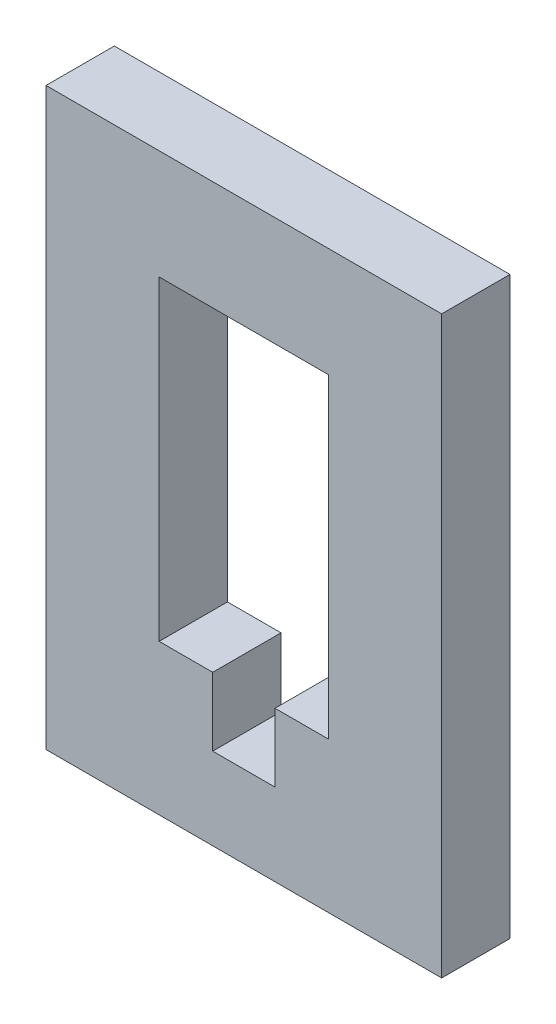
ISO-10303-21;
HEADER;
FILE_DESCRIPTION(('STEP AP214'),'2;1');
FILE_NAME('part.step','',(''),(''),'','','');
FILE_SCHEMA(('AUTOMOTIVE_DESIGN { 1 0 10303 214 1 1 1 1 }'));
ENDSEC;
DATA;
#1=APPLICATION_CONTEXT('core data for automotive mechanical design processes');
#2=APPLICATION_PROTOCOL_DEFINITION('international standard','automotive_design',2000,#1);
#3=PRODUCT_CONTEXT('',#1,'mechanical');
#4=PRODUCT('Part','Part','',(#3));
#5=PRODUCT_RELATED_PRODUCT_CATEGORY('part','',(#4));
#6=PRODUCT_DEFINITION_FORMATION('','',#4);
#7=PRODUCT_DEFINITION_CONTEXT('part definition',#1,'design');
#8=PRODUCT_DEFINITION('design','',#6,#7);
#9=PRODUCT_DEFINITION_SHAPE('','',#8);
#10=(LENGTH_UNIT() NAMED_UNIT(*) SI_UNIT(.MILLI.,.METRE.));
#11=(NAMED_UNIT(*) PLANE_ANGLE_UNIT() SI_UNIT($,.RADIAN.));
#12=(NAMED_UNIT(*) SI_UNIT($,.STERADIAN.) SOLID_ANGLE_UNIT());
#13=UNCERTAINTY_MEASURE_WITH_UNIT(LENGTH_MEASURE(1.E-05),#10,'distance_accuracy_value','');
#14=(GEOMETRIC_REPRESENTATION_CONTEXT(3) GLOBAL_UNCERTAINTY_ASSIGNED_CONTEXT((#13)) GLOBAL_UNIT_ASSIGNED_CONTEXT((#10,
#11,#12)) REPRESENTATION_CONTEXT('',''));
#15=CARTESIAN_POINT('',(0.,0.,0.));
#16=DIRECTION('',(0.,0.,1.));
#17=DIRECTION('',(1.,0.,0.));
#18=AXIS2_PLACEMENT_3D('',#15,#16,#17);
#19=CARTESIAN_POINT('',(-18.5582300884956,31.0897345132743,5.));
#20=DIRECTION('',(0.,-1.,0.));
#21=DIRECTION('',(0.,0.,-1.));
#22=AXIS2_PLACEMENT_3D('',#19,#20,#21);
#23=PLANE('',#22);
#24=DIRECTION('',(-1.,0.,0.));
#25=VECTOR('',#24,1.);
#26=CARTESIAN_POINT('',(-18.5582300884956,31.0897345132743,5.));
#27=LINE('',#26,#25);
#28=CARTESIAN_POINT('',(-6.35823008849556,31.0897345132743,5.));
#29=VERTEX_POINT('',#28);
#30=CARTESIAN_POINT('',(-10.2782300884956,31.0897345132743,5.));
#31=VERTEX_POINT('',#30);
#32=EDGE_CURVE('E241',#29,#31,#27,.T.);
#33=ORIENTED_EDGE('',*,*,#32,.F.);
#34=DIRECTION('',(0.,0.,1.));
#35=VECTOR('',#34,1.);
#36=CARTESIAN_POINT('',(-6.35823008849556,31.0897345132743,0.));
#37=LINE('',#36,#35);
#38=CARTESIAN_POINT('',(-6.35823008849556,31.0897345132743,0.));
#39=VERTEX_POINT('',#38);
#40=EDGE_CURVE('E136',#39,#29,#37,.T.);
#41=ORIENTED_EDGE('',*,*,#40,.F.);
#42=DIRECTION('',(-1.,0.,0.));
#43=VECTOR('',#42,1.);
#44=CARTESIAN_POINT('',(-18.5582300884956,31.0897345132743,0.));
#45=LINE('',#44,#43);
#46=CARTESIAN_POINT('',(-10.2782300884956,31.0897345132743,0.));
#47=VERTEX_POINT('',#46);
#48=EDGE_CURVE('E253',#39,#47,#45,.T.);
#49=ORIENTED_EDGE('',*,*,#48,.T.);
#50=DIRECTION('',(0.,0.,-1.));
#51=VECTOR('',#50,1.);
#52=CARTESIAN_POINT('',(-10.2782300884956,31.0897345132743,0.));
#53=LINE('',#52,#51);
#54=EDGE_CURVE('E213',#31,#47,#53,.T.);
#55=ORIENTED_EDGE('',*,*,#54,.F.);
#56=EDGE_LOOP('',(#33,#41,#49,#55));
#57=FACE_BOUND('',#56,.T.);
#58=ADVANCED_FACE('F39',(#57),#23,.F.);
#59=CARTESIAN_POINT('',(2.12176991150444,31.0897345132743,0.));
#60=VERTEX_POINT('',#59);
#61=CARTESIAN_POINT('',(-1.79823008849555,31.0897345132743,0.));
#62=VERTEX_POINT('',#61);
#63=EDGE_CURVE('E235',#60,#62,#45,.T.);
#64=ORIENTED_EDGE('',*,*,#63,.T.);
#65=DIRECTION('',(0.,0.,-1.));
#66=VECTOR('',#65,1.);
#67=CARTESIAN_POINT('',(-1.79823008849555,31.0897345132743,0.));
#68=LINE('',#67,#66);
#69=CARTESIAN_POINT('',(-1.79823008849555,31.0897345132743,5.));
#70=VERTEX_POINT('',#69);
#71=EDGE_CURVE('E150',#70,#62,#68,.T.);
#72=ORIENTED_EDGE('',*,*,#71,.F.);
#73=CARTESIAN_POINT('',(2.12176991150444,31.0897345132743,5.));
#74=VERTEX_POINT('',#73);
#75=EDGE_CURVE('E63',#74,#70,#27,.T.);
#76=ORIENTED_EDGE('',*,*,#75,.F.);
#77=DIRECTION('',(0.,0.,1.));
#78=VECTOR('',#77,1.);
#79=CARTESIAN_POINT('',(2.12176991150444,31.0897345132743,0.));
#80=LINE('',#79,#78);
#81=EDGE_CURVE('E192',#60,#74,#80,.T.);
#82=ORIENTED_EDGE('',*,*,#81,.F.);
#83=EDGE_LOOP('',(#64,#72,#76,#82));
#84=FACE_BOUND('',#83,.T.);
#85=ADVANCED_FACE('F281',(#84),#23,.F.);
#86=CARTESIAN_POINT('',(-18.5582300884956,31.0897345132743,5.));
#87=DIRECTION('',(1.,0.,0.));
#88=DIRECTION('',(0.,1.,0.));
#89=AXIS2_PLACEMENT_3D('',#86,#87,#88);
#90=PLANE('',#89);
#91=DIRECTION('',(0.,-1.,0.));
#92=VECTOR('',#91,1.);
#93=CARTESIAN_POINT('',(-18.5582300884956,31.0897345132743,0.));
#94=LINE('',#93,#92);
#95=CARTESIAN_POINT('',(-18.5582300884956,62.1897345132743,0.));
#96=VERTEX_POINT('',#95);
#97=CARTESIAN_POINT('',(-18.5582300884956,20.0897345132743,0.));
#98=VERTEX_POINT('',#97);
#99=EDGE_CURVE('E229',#96,#98,#94,.T.);
#100=ORIENTED_EDGE('',*,*,#99,.T.);
#101=DIRECTION('',(0.,0.,-1.));
#102=VECTOR('',#101,1.);
#103=CARTESIAN_POINT('',(-18.5582300884956,20.0897345132743,5.));
#104=LINE('',#103,#102);
#105=CARTESIAN_POINT('',(-18.5582300884956,20.0897345132743,5.));
#106=VERTEX_POINT('',#105);
#107=EDGE_CURVE('E11',#106,#98,#104,.T.);
#108=ORIENTED_EDGE('',*,*,#107,.F.);
#109=DIRECTION('',(0.,-1.,0.));
#110=VECTOR('',#109,1.);
#111=CARTESIAN_POINT('',(-18.5582300884956,31.0897345132743,5.));
#112=LINE('',#111,#110);
#113=CARTESIAN_POINT('',(-18.5582300884956,62.1897345132743,5.));
#114=VERTEX_POINT('',#113);
#115=EDGE_CURVE('E230',#114,#106,#112,.T.);
#116=ORIENTED_EDGE('',*,*,#115,.F.);
#117=DIRECTION('',(0.,0.,1.));
#118=VECTOR('',#117,1.);
#119=CARTESIAN_POINT('',(-18.5582300884956,62.1897345132743,0.));
#120=LINE('',#119,#118);
#121=EDGE_CURVE('E175',#96,#114,#120,.T.);
#122=ORIENTED_EDGE('',*,*,#121,.F.);
#123=EDGE_LOOP('',(#100,#108,#116,#122));
#124=FACE_BOUND('',#123,.T.);
#125=ADVANCED_FACE('F41',(#124),#90,.F.);
#126=CARTESIAN_POINT('',(-18.5582300884956,20.0897345132743,5.));
#127=DIRECTION('',(0.,1.,0.));
#128=DIRECTION('',(0.,0.,1.));
#129=AXIS2_PLACEMENT_3D('',#126,#127,#128);
#130=PLANE('',#129);
#131=DIRECTION('',(1.,0.,0.));
#132=VECTOR('',#131,1.);
#133=CARTESIAN_POINT('',(-18.5582300884956,20.0897345132743,0.));
#134=LINE('',#133,#132);
#135=CARTESIAN_POINT('',(10.4017699115044,20.0897345132743,0.));
#136=VERTEX_POINT('',#135);
#137=EDGE_CURVE('E247',#98,#136,#134,.T.);
#138=ORIENTED_EDGE('',*,*,#137,.T.);
#139=DIRECTION('',(0.,0.,-1.));
#140=VECTOR('',#139,1.);
#141=CARTESIAN_POINT('',(10.4017699115044,20.0897345132743,5.));
#142=LINE('',#141,#140);
#143=CARTESIAN_POINT('',(10.4017699115044,20.0897345132743,5.));
#144=VERTEX_POINT('',#143);
#145=EDGE_CURVE('E48',#144,#136,#142,.T.);
#146=ORIENTED_EDGE('',*,*,#145,.F.);
#147=DIRECTION('',(1.,0.,0.));
#148=VECTOR('',#147,1.);
#149=CARTESIAN_POINT('',(-18.5582300884956,20.0897345132743,5.));
#150=LINE('',#149,#148);
#151=EDGE_CURVE('E234',#106,#144,#150,.T.);
#152=ORIENTED_EDGE('',*,*,#151,.F.);
#153=ORIENTED_EDGE('',*,*,#107,.T.);
#154=EDGE_LOOP('',(#138,#146,#152,#153));
#155=FACE_BOUND('',#154,.T.);
#156=ADVANCED_FACE('F274',(#155),#130,.F.);
#157=CARTESIAN_POINT('',(10.4017699115044,31.0897345132743,5.));
#158=DIRECTION('',(-1.,0.,0.));
#159=DIRECTION('',(0.,-1.,0.));
#160=AXIS2_PLACEMENT_3D('',#157,#158,#159);
#161=PLANE('',#160);
#162=DIRECTION('',(0.,1.,0.));
#163=VECTOR('',#162,1.);
#164=CARTESIAN_POINT('',(10.4017699115044,31.0897345132743,0.));
#165=LINE('',#164,#163);
#166=CARTESIAN_POINT('',(10.4017699115044,62.1897345132743,0.));
#167=VERTEX_POINT('',#166);
#168=EDGE_CURVE('E250',#136,#167,#165,.T.);
#169=ORIENTED_EDGE('',*,*,#168,.T.);
#170=DIRECTION('',(0.,0.,-1.));
#171=VECTOR('',#170,1.);
#172=CARTESIAN_POINT('',(10.4017699115044,62.1897345132743,0.));
#173=LINE('',#172,#171);
#174=CARTESIAN_POINT('',(10.4017699115044,62.1897345132743,5.));
#175=VERTEX_POINT('',#174);
#176=EDGE_CURVE('E184',#175,#167,#173,.T.);
#177=ORIENTED_EDGE('',*,*,#176,.F.);
#178=DIRECTION('',(0.,1.,0.));
#179=VECTOR('',#178,1.);
#180=CARTESIAN_POINT('',(10.4017699115044,31.0897345132743,5.));
#181=LINE('',#180,#179);
#182=EDGE_CURVE('E238',#144,#175,#181,.T.);
#183=ORIENTED_EDGE('',*,*,#182,.F.);
#184=ORIENTED_EDGE('',*,*,#145,.T.);
#185=EDGE_LOOP('',(#169,#177,#183,#184));
#186=FACE_BOUND('',#185,.T.);
#187=ADVANCED_FACE('F262',(#186),#161,.F.);
#188=CARTESIAN_POINT('',(0.,0.,5.));
#189=DIRECTION('',(0.,0.,1.));
#190=DIRECTION('',(1.,0.,0.));
#191=AXIS2_PLACEMENT_3D('',#188,#189,#190);
#192=PLANE('',#191);
#193=DIRECTION('',(0.,1.,0.));
#194=VECTOR('',#193,1.);
#195=CARTESIAN_POINT('',(-6.35823008849556,26.0897345132743,5.));
#196=LINE('',#195,#194);
#197=CARTESIAN_POINT('',(-6.35823008849556,26.0897345132743,5.));
#198=VERTEX_POINT('',#197);
#199=EDGE_CURVE('E131',#198,#29,#196,.T.);
#200=ORIENTED_EDGE('',*,*,#199,.T.);
#201=ORIENTED_EDGE('',*,*,#32,.T.);
#202=DIRECTION('',(0.,-1.,0.));
#203=VECTOR('',#202,1.);
#204=CARTESIAN_POINT('',(-10.2782300884956,54.1897345132743,5.));
#205=LINE('',#204,#203);
#206=CARTESIAN_POINT('',(-10.2782300884956,54.1897345132743,5.));
#207=VERTEX_POINT('',#206);
#208=EDGE_CURVE('E225',#207,#31,#205,.T.);
#209=ORIENTED_EDGE('',*,*,#208,.F.);
#210=DIRECTION('',(1.,0.,0.));
#211=VECTOR('',#210,1.);
#212=CARTESIAN_POINT('',(-18.5582300884956,54.1897345132743,5.));
#213=LINE('',#212,#211);
#214=CARTESIAN_POINT('',(2.12176991150444,54.1897345132743,5.));
#215=VERTEX_POINT('',#214);
#216=EDGE_CURVE('E168',#207,#215,#213,.T.);
#217=ORIENTED_EDGE('',*,*,#216,.T.);
#218=DIRECTION('',(0.,-1.,0.));
#219=VECTOR('',#218,1.);
#220=CARTESIAN_POINT('',(2.12176991150444,54.1897345132743,5.));
#221=LINE('',#220,#219);
#222=EDGE_CURVE('E203',#215,#74,#221,.T.);
#223=ORIENTED_EDGE('',*,*,#222,.T.);
#224=ORIENTED_EDGE('',*,*,#75,.T.);
#225=DIRECTION('',(0.,1.,0.));
#226=VECTOR('',#225,1.);
#227=CARTESIAN_POINT('',(-1.79823008849555,26.0897345132743,5.));
#228=LINE('',#227,#226);
#229=CARTESIAN_POINT('',(-1.79823008849555,26.0897345132743,5.));
#230=VERTEX_POINT('',#229);
#231=EDGE_CURVE('E141',#230,#70,#228,.T.);
#232=ORIENTED_EDGE('',*,*,#231,.F.);
#233=DIRECTION('',(1.,0.,0.));
#234=VECTOR('',#233,1.);
#235=CARTESIAN_POINT('',(-6.35823008849556,26.0897345132743,5.));
#236=LINE('',#235,#234);
#237=EDGE_CURVE('E145',#198,#230,#236,.T.);
#238=ORIENTED_EDGE('',*,*,#237,.F.);
#239=EDGE_LOOP('',(#200,#201,#209,#217,#223,#224,#232,#238));
#240=FACE_BOUND('',#239,.T.);
#241=ORIENTED_EDGE('',*,*,#115,.T.);
#242=ORIENTED_EDGE('',*,*,#151,.T.);
#243=ORIENTED_EDGE('',*,*,#182,.T.);
#244=DIRECTION('',(1.,0.,0.));
#245=VECTOR('',#244,1.);
#246=CARTESIAN_POINT('',(-18.5582300884956,62.1897345132743,5.));
#247=LINE('',#246,#245);
#248=EDGE_CURVE('E179',#114,#175,#247,.T.);
#249=ORIENTED_EDGE('',*,*,#248,.F.);
#250=EDGE_LOOP('',(#241,#242,#243,#249));
#251=FACE_BOUND('',#250,.T.);
#252=ADVANCED_FACE('F152',(#240,#251),#192,.T.);
#253=CARTESIAN_POINT('',(0.,0.,0.));
#254=DIRECTION('',(0.,0.,1.));
#255=DIRECTION('',(1.,0.,0.));
#256=AXIS2_PLACEMENT_3D('',#253,#254,#255);
#257=PLANE('',#256);
#258=ORIENTED_EDGE('',*,*,#48,.F.);
#259=DIRECTION('',(0.,1.,0.));
#260=VECTOR('',#259,1.);
#261=CARTESIAN_POINT('',(-6.35823008849556,26.0897345132743,0.));
#262=LINE('',#261,#260);
#263=CARTESIAN_POINT('',(-6.35823008849556,26.0897345132743,0.));
#264=VERTEX_POINT('',#263);
#265=EDGE_CURVE('E165',#264,#39,#262,.T.);
#266=ORIENTED_EDGE('',*,*,#265,.F.);
#267=DIRECTION('',(-1.,0.,0.));
#268=VECTOR('',#267,1.);
#269=CARTESIAN_POINT('',(-6.35823008849556,26.0897345132743,0.));
#270=LINE('',#269,#268);
#271=CARTESIAN_POINT('',(-1.79823008849555,26.0897345132743,0.));
#272=VERTEX_POINT('',#271);
#273=EDGE_CURVE('E142',#272,#264,#270,.T.);
#274=ORIENTED_EDGE('',*,*,#273,.F.);
#275=DIRECTION('',(0.,1.,0.));
#276=VECTOR('',#275,1.);
#277=CARTESIAN_POINT('',(-1.79823008849555,26.0897345132743,0.));
#278=LINE('',#277,#276);
#279=EDGE_CURVE('E169',#272,#62,#278,.T.);
#280=ORIENTED_EDGE('',*,*,#279,.T.);
#281=ORIENTED_EDGE('',*,*,#63,.F.);
#282=DIRECTION('',(0.,-1.,0.));
#283=VECTOR('',#282,1.);
#284=CARTESIAN_POINT('',(2.12176991150444,54.1897345132743,0.));
#285=LINE('',#284,#283);
#286=CARTESIAN_POINT('',(2.12176991150444,54.1897345132743,0.));
#287=VERTEX_POINT('',#286);
#288=EDGE_CURVE('E209',#287,#60,#285,.T.);
#289=ORIENTED_EDGE('',*,*,#288,.F.);
#290=DIRECTION('',(-1.,0.,0.));
#291=VECTOR('',#290,1.);
#292=CARTESIAN_POINT('',(-18.5582300884956,54.1897345132743,0.));
#293=LINE('',#292,#291);
#294=CARTESIAN_POINT('',(-10.2782300884956,54.1897345132743,0.));
#295=VERTEX_POINT('',#294);
#296=EDGE_CURVE('E180',#287,#295,#293,.T.);
#297=ORIENTED_EDGE('',*,*,#296,.T.);
#298=DIRECTION('',(0.,-1.,0.));
#299=VECTOR('',#298,1.);
#300=CARTESIAN_POINT('',(-10.2782300884956,54.1897345132743,0.));
#301=LINE('',#300,#299);
#302=EDGE_CURVE('E218',#295,#47,#301,.T.);
#303=ORIENTED_EDGE('',*,*,#302,.T.);
#304=EDGE_LOOP('',(#258,#266,#274,#280,#281,#289,#297,#303));
#305=FACE_BOUND('',#304,.T.);
#306=ORIENTED_EDGE('',*,*,#99,.F.);
#307=DIRECTION('',(-1.,0.,0.));
#308=VECTOR('',#307,1.);
#309=CARTESIAN_POINT('',(-18.5582300884956,62.1897345132743,0.));
#310=LINE('',#309,#308);
#311=EDGE_CURVE('E188',#167,#96,#310,.T.);
#312=ORIENTED_EDGE('',*,*,#311,.F.);
#313=ORIENTED_EDGE('',*,*,#168,.F.);
#314=ORIENTED_EDGE('',*,*,#137,.F.);
#315=EDGE_LOOP('',(#306,#312,#313,#314));
#316=FACE_BOUND('',#315,.T.);
#317=ADVANCED_FACE('F267',(#305,#316),#257,.F.);
#318=CARTESIAN_POINT('',(-10.2782300884956,54.1897345132743,0.));
#319=DIRECTION('',(-1.,0.,0.));
#320=DIRECTION('',(0.,0.,1.));
#321=AXIS2_PLACEMENT_3D('',#318,#319,#320);
#322=PLANE('',#321);
#323=ORIENTED_EDGE('',*,*,#54,.T.);
#324=ORIENTED_EDGE('',*,*,#302,.F.);
#325=DIRECTION('',(0.,0.,-1.));
#326=VECTOR('',#325,1.);
#327=CARTESIAN_POINT('',(-10.2782300884956,54.1897345132743,0.));
#328=LINE('',#327,#326);
#329=EDGE_CURVE('E214',#207,#295,#328,.T.);
#330=ORIENTED_EDGE('',*,*,#329,.F.);
#331=ORIENTED_EDGE('',*,*,#208,.T.);
#332=EDGE_LOOP('',(#323,#324,#330,#331));
#333=FACE_BOUND('',#332,.T.);
#334=ADVANCED_FACE('F291',(#333),#322,.F.);
#335=CARTESIAN_POINT('',(2.12176991150444,54.1897345132743,0.));
#336=DIRECTION('',(1.,0.,0.));
#337=DIRECTION('',(0.,0.,-1.));
#338=AXIS2_PLACEMENT_3D('',#335,#336,#337);
#339=PLANE('',#338);
#340=ORIENTED_EDGE('',*,*,#81,.T.);
#341=ORIENTED_EDGE('',*,*,#222,.F.);
#342=DIRECTION('',(0.,0.,1.));
#343=VECTOR('',#342,1.);
#344=CARTESIAN_POINT('',(2.12176991150444,54.1897345132743,0.));
#345=LINE('',#344,#343);
#346=EDGE_CURVE('E199',#287,#215,#345,.T.);
#347=ORIENTED_EDGE('',*,*,#346,.F.);
#348=ORIENTED_EDGE('',*,*,#288,.T.);
#349=EDGE_LOOP('',(#340,#341,#347,#348));
#350=FACE_BOUND('',#349,.T.);
#351=ADVANCED_FACE('F297',(#350),#339,.F.);
#352=CARTESIAN_POINT('',(0.,54.1897345132743,0.));
#353=DIRECTION('',(0.,1.,0.));
#354=DIRECTION('',(0.,0.,1.));
#355=AXIS2_PLACEMENT_3D('',#352,#353,#354);
#356=PLANE('',#355);
#357=ORIENTED_EDGE('',*,*,#216,.F.);
#358=ORIENTED_EDGE('',*,*,#329,.T.);
#359=ORIENTED_EDGE('',*,*,#296,.F.);
#360=ORIENTED_EDGE('',*,*,#346,.T.);
#361=EDGE_LOOP('',(#357,#358,#359,#360));
#362=FACE_BOUND('',#361,.T.);
#363=ADVANCED_FACE('F301',(#362),#356,.F.);
#364=CARTESIAN_POINT('',(0.,62.1897345132743,0.));
#365=DIRECTION('',(0.,1.,0.));
#366=DIRECTION('',(0.,0.,1.));
#367=AXIS2_PLACEMENT_3D('',#364,#365,#366);
#368=PLANE('',#367);
#369=ORIENTED_EDGE('',*,*,#121,.T.);
#370=ORIENTED_EDGE('',*,*,#248,.T.);
#371=ORIENTED_EDGE('',*,*,#176,.T.);
#372=ORIENTED_EDGE('',*,*,#311,.T.);
#373=EDGE_LOOP('',(#369,#370,#371,#372));
#374=FACE_BOUND('',#373,.T.);
#375=ADVANCED_FACE('F270',(#374),#368,.T.);
#376=CARTESIAN_POINT('',(-6.35823008849556,26.0897345132743,0.));
#377=DIRECTION('',(-1.,0.,0.));
#378=DIRECTION('',(0.,0.,1.));
#379=AXIS2_PLACEMENT_3D('',#376,#377,#378);
#380=PLANE('',#379);
#381=ORIENTED_EDGE('',*,*,#40,.T.);
#382=ORIENTED_EDGE('',*,*,#199,.F.);
#383=DIRECTION('',(0.,0.,1.));
#384=VECTOR('',#383,1.);
#385=CARTESIAN_POINT('',(-6.35823008849556,26.0897345132743,0.));
#386=LINE('',#385,#384);
#387=EDGE_CURVE('E134',#264,#198,#386,.T.);
#388=ORIENTED_EDGE('',*,*,#387,.F.);
#389=ORIENTED_EDGE('',*,*,#265,.T.);
#390=EDGE_LOOP('',(#381,#382,#388,#389));
#391=FACE_BOUND('',#390,.T.);
#392=ADVANCED_FACE('F133',(#391),#380,.F.);
#393=CARTESIAN_POINT('',(-1.79823008849555,26.0897345132743,0.));
#394=DIRECTION('',(1.,0.,0.));
#395=DIRECTION('',(0.,0.,-1.));
#396=AXIS2_PLACEMENT_3D('',#393,#394,#395);
#397=PLANE('',#396);
#398=ORIENTED_EDGE('',*,*,#71,.T.);
#399=ORIENTED_EDGE('',*,*,#279,.F.);
#400=DIRECTION('',(0.,0.,-1.));
#401=VECTOR('',#400,1.);
#402=CARTESIAN_POINT('',(-1.79823008849555,26.0897345132743,0.));
#403=LINE('',#402,#401);
#404=EDGE_CURVE('E55',#230,#272,#403,.T.);
#405=ORIENTED_EDGE('',*,*,#404,.F.);
#406=ORIENTED_EDGE('',*,*,#231,.T.);
#407=EDGE_LOOP('',(#398,#399,#405,#406));
#408=FACE_BOUND('',#407,.T.);
#409=ADVANCED_FACE('F310',(#408),#397,.F.);
#410=CARTESIAN_POINT('',(0.,26.0897345132743,0.));
#411=DIRECTION('',(0.,1.,0.));
#412=DIRECTION('',(0.,0.,1.));
#413=AXIS2_PLACEMENT_3D('',#410,#411,#412);
#414=PLANE('',#413);
#415=ORIENTED_EDGE('',*,*,#387,.T.);
#416=ORIENTED_EDGE('',*,*,#237,.T.);
#417=ORIENTED_EDGE('',*,*,#404,.T.);
#418=ORIENTED_EDGE('',*,*,#273,.T.);
#419=EDGE_LOOP('',(#415,#416,#417,#418));
#420=FACE_BOUND('',#419,.T.);
#421=ADVANCED_FACE('F144',(#420),#414,.T.);
#422=CLOSED_SHELL('',(#58,#85,#125,#156,#187,#252,#317,#334,#351,#363,#375,#392,#409,#421));
#423=MANIFOLD_SOLID_BREP('B2',#422);
#424=ADVANCED_BREP_SHAPE_REPRESENTATION('',(#18,#423),#14);
#425=SHAPE_DEFINITION_REPRESENTATION(#9,#424);
ENDSEC;
END-ISO-10303-21;
